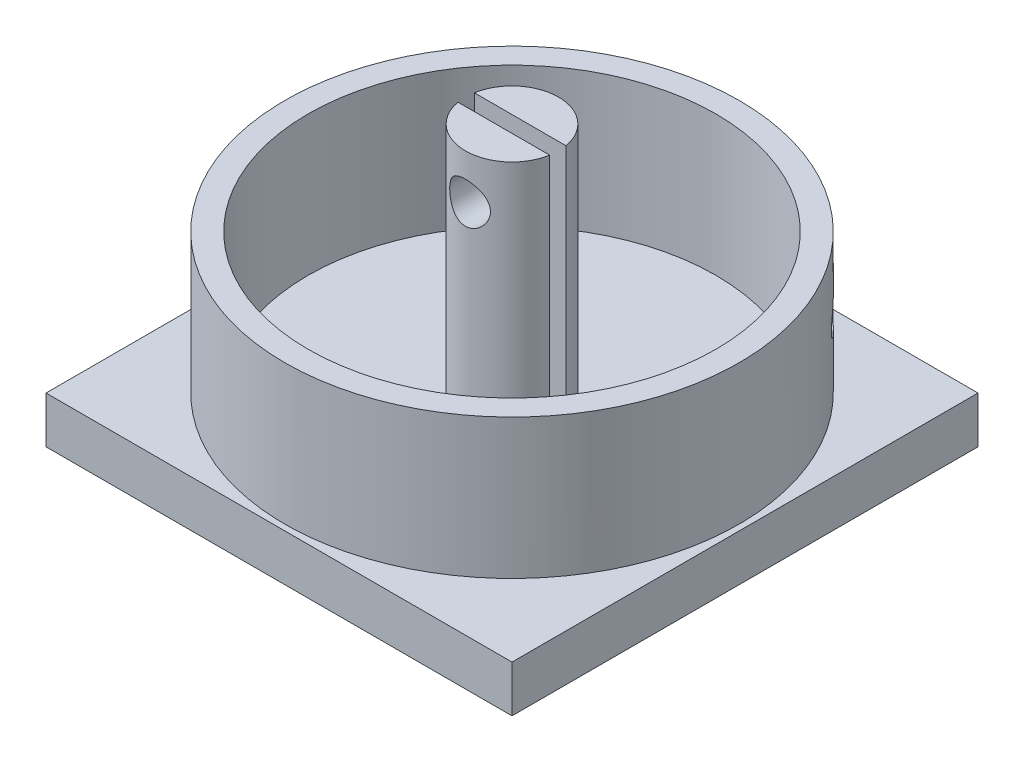
ISO-10303-21;
HEADER;
FILE_DESCRIPTION(('STEP AP214'),'2;1');
FILE_NAME('part.step','',(''),(''),'','','');
FILE_SCHEMA(('AUTOMOTIVE_DESIGN { 1 0 10303 214 1 1 1 1 }'));
ENDSEC;
DATA;
#1=APPLICATION_CONTEXT('core data for automotive mechanical design processes');
#2=APPLICATION_PROTOCOL_DEFINITION('international standard','automotive_design',2000,#1);
#3=PRODUCT_CONTEXT('',#1,'mechanical');
#4=PRODUCT('Part','Part','',(#3));
#5=PRODUCT_RELATED_PRODUCT_CATEGORY('part','',(#4));
#6=PRODUCT_DEFINITION_FORMATION('','',#4);
#7=PRODUCT_DEFINITION_CONTEXT('part definition',#1,'design');
#8=PRODUCT_DEFINITION('design','',#6,#7);
#9=PRODUCT_DEFINITION_SHAPE('','',#8);
#10=(LENGTH_UNIT() NAMED_UNIT(*) SI_UNIT(.MILLI.,.METRE.));
#11=(NAMED_UNIT(*) PLANE_ANGLE_UNIT() SI_UNIT($,.RADIAN.));
#12=(NAMED_UNIT(*) SI_UNIT($,.STERADIAN.) SOLID_ANGLE_UNIT());
#13=UNCERTAINTY_MEASURE_WITH_UNIT(LENGTH_MEASURE(1.E-05),#10,'distance_accuracy_value','');
#14=(GEOMETRIC_REPRESENTATION_CONTEXT(3) GLOBAL_UNCERTAINTY_ASSIGNED_CONTEXT((#13)) GLOBAL_UNIT_ASSIGNED_CONTEXT((#10,
#11,#12)) REPRESENTATION_CONTEXT('',''));
#15=CARTESIAN_POINT('',(0.,0.,0.));
#16=DIRECTION('',(0.,0.,1.));
#17=DIRECTION('',(1.,0.,0.));
#18=AXIS2_PLACEMENT_3D('',#15,#16,#17);
#19=CARTESIAN_POINT('',(0.,2.,0.));
#20=DIRECTION('',(0.,-1.,0.));
#21=DIRECTION('',(0.,0.,-1.));
#22=AXIS2_PLACEMENT_3D('',#19,#20,#21);
#23=PLANE('',#22);
#24=DIRECTION('',(1.,0.,0.));
#25=VECTOR('',#24,1.);
#26=CARTESIAN_POINT('',(0.,2.,86.5723559333128));
#27=LINE('',#26,#25);
#28=CARTESIAN_POINT('',(-27.8775764276021,2.,86.5723559333128));
#29=VERTEX_POINT('',#28);
#30=CARTESIAN_POINT('',(-23.9393026940991,2.,86.5723559333128));
#31=VERTEX_POINT('',#30);
#32=EDGE_CURVE('E220',#29,#31,#27,.T.);
#33=ORIENTED_EDGE('',*,*,#32,.F.);
#34=CARTESIAN_POINT('',(-25.9084395608506,2.,86.9223559333128));
#35=DIRECTION('',(0.,1.,0.));
#36=DIRECTION('',(0.,0.,1.));
#37=AXIS2_PLACEMENT_3D('',#34,#35,#36);
#38=CIRCLE('',#37,2.);
#39=EDGE_CURVE('E224',#31,#29,#38,.T.);
#40=ORIENTED_EDGE('',*,*,#39,.F.);
#41=EDGE_LOOP('',(#33,#40));
#42=FACE_BOUND('',#41,.T.);
#43=CARTESIAN_POINT('',(-25.9084395608506,2.,86.9223559333128));
#44=DIRECTION('',(0.,1.,0.));
#45=DIRECTION('',(0.,0.,1.));
#46=AXIS2_PLACEMENT_3D('',#43,#44,#45);
#47=CIRCLE('',#46,8.75000000000001);
#48=CARTESIAN_POINT('',(-25.9084395608506,2.,95.6723559333128));
#49=VERTEX_POINT('',#48);
#50=EDGE_CURVE('E236',#49,#49,#47,.T.);
#51=ORIENTED_EDGE('',*,*,#50,.T.);
#52=EDGE_LOOP('',(#51));
#53=FACE_BOUND('',#52,.T.);
#54=CARTESIAN_POINT('',(-25.9084395608506,2.,86.9223559333128));
#55=DIRECTION('',(0.,1.,0.));
#56=DIRECTION('',(0.,0.,1.));
#57=AXIS2_PLACEMENT_3D('',#54,#55,#56);
#58=CIRCLE('',#57,2.);
#59=CARTESIAN_POINT('',(-27.8775764276021,2.,87.2723559333128));
#60=VERTEX_POINT('',#59);
#61=CARTESIAN_POINT('',(-23.9393026940991,2.,87.2723559333128));
#62=VERTEX_POINT('',#61);
#63=EDGE_CURVE('E152',#60,#62,#58,.T.);
#64=ORIENTED_EDGE('',*,*,#63,.F.);
#65=DIRECTION('',(1.,0.,0.));
#66=VECTOR('',#65,1.);
#67=CARTESIAN_POINT('',(0.,2.,87.2723559333128));
#68=LINE('',#67,#66);
#69=EDGE_CURVE('E206',#60,#62,#68,.T.);
#70=ORIENTED_EDGE('',*,*,#69,.T.);
#71=EDGE_LOOP('',(#64,#70));
#72=FACE_BOUND('',#71,.T.);
#73=ADVANCED_FACE('F47',(#42,#53,#72),#23,.F.);
#74=CARTESIAN_POINT('',(-35.9084395608506,2.,96.9223559333128));
#75=DIRECTION('',(0.,0.,-1.));
#76=DIRECTION('',(-1.,0.,0.));
#77=AXIS2_PLACEMENT_3D('',#74,#75,#76);
#78=PLANE('',#77);
#79=DIRECTION('',(1.,0.,0.));
#80=VECTOR('',#79,1.);
#81=CARTESIAN_POINT('',(-35.9084395608506,0.,96.9223559333128));
#82=LINE('',#81,#80);
#83=CARTESIAN_POINT('',(-35.9084395608506,0.,96.9223559333128));
#84=VERTEX_POINT('',#83);
#85=CARTESIAN_POINT('',(-15.9084395608506,0.,96.9223559333128));
#86=VERTEX_POINT('',#85);
#87=EDGE_CURVE('E248',#84,#86,#82,.T.);
#88=ORIENTED_EDGE('',*,*,#87,.T.);
#89=DIRECTION('',(0.,-1.,0.));
#90=VECTOR('',#89,1.);
#91=CARTESIAN_POINT('',(-15.9084395608506,2.,96.9223559333128));
#92=LINE('',#91,#90);
#93=CARTESIAN_POINT('',(-15.9084395608506,2.,96.9223559333128));
#94=VERTEX_POINT('',#93);
#95=EDGE_CURVE('E287',#94,#86,#92,.T.);
#96=ORIENTED_EDGE('',*,*,#95,.F.);
#97=DIRECTION('',(1.,0.,0.));
#98=VECTOR('',#97,1.);
#99=CARTESIAN_POINT('',(-35.9084395608506,2.,96.9223559333128));
#100=LINE('',#99,#98);
#101=CARTESIAN_POINT('',(-35.9084395608506,2.,96.9223559333128));
#102=VERTEX_POINT('',#101);
#103=EDGE_CURVE('E249',#102,#94,#100,.T.);
#104=ORIENTED_EDGE('',*,*,#103,.F.);
#105=DIRECTION('',(0.,-1.,0.));
#106=VECTOR('',#105,1.);
#107=CARTESIAN_POINT('',(-35.9084395608506,2.,96.9223559333128));
#108=LINE('',#107,#106);
#109=EDGE_CURVE('E264',#102,#84,#108,.T.);
#110=ORIENTED_EDGE('',*,*,#109,.T.);
#111=EDGE_LOOP('',(#88,#96,#104,#110));
#112=FACE_BOUND('',#111,.T.);
#113=ADVANCED_FACE('F49',(#112),#78,.F.);
#114=CARTESIAN_POINT('',(-15.9084395608506,2.,76.9223559333128));
#115=DIRECTION('',(1.,0.,0.));
#116=DIRECTION('',(0.,0.,-1.));
#117=AXIS2_PLACEMENT_3D('',#114,#115,#116);
#118=PLANE('',#117);
#119=DIRECTION('',(0.,0.,1.));
#120=VECTOR('',#119,1.);
#121=CARTESIAN_POINT('',(-15.9084395608506,0.,76.9223559333128));
#122=LINE('',#121,#120);
#123=CARTESIAN_POINT('',(-15.9084395608506,0.,76.9223559333128));
#124=VERTEX_POINT('',#123);
#125=EDGE_CURVE('E268',#124,#86,#122,.T.);
#126=ORIENTED_EDGE('',*,*,#125,.F.);
#127=DIRECTION('',(0.,-1.,0.));
#128=VECTOR('',#127,1.);
#129=CARTESIAN_POINT('',(-15.9084395608506,2.,76.9223559333128));
#130=LINE('',#129,#128);
#131=CARTESIAN_POINT('',(-15.9084395608506,2.,76.9223559333128));
#132=VERTEX_POINT('',#131);
#133=EDGE_CURVE('E284',#132,#124,#130,.T.);
#134=ORIENTED_EDGE('',*,*,#133,.F.);
#135=DIRECTION('',(0.,0.,1.));
#136=VECTOR('',#135,1.);
#137=CARTESIAN_POINT('',(-15.9084395608506,2.,76.9223559333128));
#138=LINE('',#137,#136);
#139=EDGE_CURVE('E252',#132,#94,#138,.T.);
#140=ORIENTED_EDGE('',*,*,#139,.T.);
#141=ORIENTED_EDGE('',*,*,#95,.T.);
#142=EDGE_LOOP('',(#126,#134,#140,#141));
#143=FACE_BOUND('',#142,.T.);
#144=ADVANCED_FACE('F345',(#143),#118,.T.);
#145=CARTESIAN_POINT('',(-35.9084395608506,2.,76.9223559333128));
#146=DIRECTION('',(0.,0.,-1.));
#147=DIRECTION('',(-1.,0.,0.));
#148=AXIS2_PLACEMENT_3D('',#145,#146,#147);
#149=PLANE('',#148);
#150=DIRECTION('',(1.,0.,0.));
#151=VECTOR('',#150,1.);
#152=CARTESIAN_POINT('',(-35.9084395608506,0.,76.9223559333128));
#153=LINE('',#152,#151);
#154=CARTESIAN_POINT('',(-35.9084395608506,0.,76.9223559333128));
#155=VERTEX_POINT('',#154);
#156=EDGE_CURVE('E272',#155,#124,#153,.T.);
#157=ORIENTED_EDGE('',*,*,#156,.F.);
#158=DIRECTION('',(0.,-1.,0.));
#159=VECTOR('',#158,1.);
#160=CARTESIAN_POINT('',(-35.9084395608506,2.,76.9223559333128));
#161=LINE('',#160,#159);
#162=CARTESIAN_POINT('',(-35.9084395608506,2.,76.9223559333128));
#163=VERTEX_POINT('',#162);
#164=EDGE_CURVE('E281',#163,#155,#161,.T.);
#165=ORIENTED_EDGE('',*,*,#164,.F.);
#166=DIRECTION('',(1.,0.,0.));
#167=VECTOR('',#166,1.);
#168=CARTESIAN_POINT('',(-35.9084395608506,2.,76.9223559333128));
#169=LINE('',#168,#167);
#170=EDGE_CURVE('E257',#163,#132,#169,.T.);
#171=ORIENTED_EDGE('',*,*,#170,.T.);
#172=ORIENTED_EDGE('',*,*,#133,.T.);
#173=EDGE_LOOP('',(#157,#165,#171,#172));
#174=FACE_BOUND('',#173,.T.);
#175=ADVANCED_FACE('F359',(#174),#149,.T.);
#176=CARTESIAN_POINT('',(-35.9084395608506,2.,76.9223559333128));
#177=DIRECTION('',(1.,0.,0.));
#178=DIRECTION('',(0.,0.,-1.));
#179=AXIS2_PLACEMENT_3D('',#176,#177,#178);
#180=PLANE('',#179);
#181=DIRECTION('',(0.,0.,1.));
#182=VECTOR('',#181,1.);
#183=CARTESIAN_POINT('',(-35.9084395608506,0.,76.9223559333128));
#184=LINE('',#183,#182);
#185=EDGE_CURVE('E253',#155,#84,#184,.T.);
#186=ORIENTED_EDGE('',*,*,#185,.T.);
#187=ORIENTED_EDGE('',*,*,#109,.F.);
#188=DIRECTION('',(0.,0.,1.));
#189=VECTOR('',#188,1.);
#190=CARTESIAN_POINT('',(-35.9084395608506,2.,76.9223559333128));
#191=LINE('',#190,#189);
#192=EDGE_CURVE('E261',#163,#102,#191,.T.);
#193=ORIENTED_EDGE('',*,*,#192,.F.);
#194=ORIENTED_EDGE('',*,*,#164,.T.);
#195=EDGE_LOOP('',(#186,#187,#193,#194));
#196=FACE_BOUND('',#195,.T.);
#197=ADVANCED_FACE('F351',(#196),#180,.F.);
#198=CARTESIAN_POINT('',(-25.9084395608506,2.,86.9223559333128));
#199=DIRECTION('',(0.,-1.,0.));
#200=DIRECTION('',(0.,0.,-1.));
#201=AXIS2_PLACEMENT_3D('',#198,#199,#200);
#202=CIRCLE('',#201,9.75);
#203=CARTESIAN_POINT('',(-25.9084395608506,2.,77.1723559333128));
#204=VERTEX_POINT('',#203);
#205=EDGE_CURVE('E290',#204,#204,#202,.F.);
#206=ORIENTED_EDGE('',*,*,#205,.F.);
#207=EDGE_LOOP('',(#206));
#208=FACE_BOUND('',#207,.T.);
#209=ORIENTED_EDGE('',*,*,#103,.T.);
#210=ORIENTED_EDGE('',*,*,#139,.F.);
#211=ORIENTED_EDGE('',*,*,#170,.F.);
#212=ORIENTED_EDGE('',*,*,#192,.T.);
#213=EDGE_LOOP('',(#209,#210,#211,#212));
#214=FACE_BOUND('',#213,.T.);
#215=ADVANCED_FACE('F340',(#208,#214),#23,.F.);
#216=CARTESIAN_POINT('',(0.,0.,0.));
#217=DIRECTION('',(0.,-1.,0.));
#218=DIRECTION('',(0.,0.,-1.));
#219=AXIS2_PLACEMENT_3D('',#216,#217,#218);
#220=PLANE('',#219);
#221=ORIENTED_EDGE('',*,*,#87,.F.);
#222=ORIENTED_EDGE('',*,*,#185,.F.);
#223=ORIENTED_EDGE('',*,*,#156,.T.);
#224=ORIENTED_EDGE('',*,*,#125,.T.);
#225=EDGE_LOOP('',(#221,#222,#223,#224));
#226=FACE_BOUND('',#225,.T.);
#227=ADVANCED_FACE('F350',(#226),#220,.T.);
#228=CARTESIAN_POINT('',(-25.9084395608506,8.,86.9223559333128));
#229=DIRECTION('',(0.,1.,0.));
#230=DIRECTION('',(0.,0.,1.));
#231=AXIS2_PLACEMENT_3D('',#228,#229,#230);
#232=PLANE('',#231);
#233=CARTESIAN_POINT('',(-25.9084395608506,8.,86.9223559333128));
#234=DIRECTION('',(0.,1.,0.));
#235=DIRECTION('',(0.,0.,1.));
#236=AXIS2_PLACEMENT_3D('',#233,#234,#235);
#237=CIRCLE('',#236,9.75);
#238=CARTESIAN_POINT('',(-25.9084395608506,8.,96.6723559333128));
#239=VERTEX_POINT('',#238);
#240=EDGE_CURVE('E241',#239,#239,#237,.T.);
#241=ORIENTED_EDGE('',*,*,#240,.T.);
#242=EDGE_LOOP('',(#241));
#243=FACE_BOUND('',#242,.T.);
#244=CARTESIAN_POINT('',(-25.9084395608506,8.,86.9223559333128));
#245=DIRECTION('',(0.,1.,0.));
#246=DIRECTION('',(0.,0.,1.));
#247=AXIS2_PLACEMENT_3D('',#244,#245,#246);
#248=CIRCLE('',#247,8.75000000000001);
#249=CARTESIAN_POINT('',(-25.9084395608506,8.,95.6723559333128));
#250=VERTEX_POINT('',#249);
#251=EDGE_CURVE('E237',#250,#250,#248,.T.);
#252=ORIENTED_EDGE('',*,*,#251,.F.);
#253=EDGE_LOOP('',(#252));
#254=FACE_BOUND('',#253,.T.);
#255=ADVANCED_FACE('F356',(#243,#254),#232,.T.);
#256=CARTESIAN_POINT('',(-25.9084395608506,8.,86.9223559333128));
#257=DIRECTION('',(0.,-1.,0.));
#258=DIRECTION('',(0.,0.,-1.));
#259=AXIS2_PLACEMENT_3D('',#256,#257,#258);
#260=CYLINDRICAL_SURFACE('',#259,9.75);
#261=CARTESIAN_POINT('',(-19.5084395608506,5.,79.5669157697331));
#262=CARTESIAN_POINT('',(-19.5084359963088,4.97238794856421,79.5669186291084));
#263=CARTESIAN_POINT('',(-19.5065172996198,4.94474269239329,79.5685869574915));
#264=CARTESIAN_POINT('',(-19.4989723384031,4.89031774963788,79.5751623715159));
#265=CARTESIAN_POINT('',(-19.4933369869705,4.863540353668,79.5800773950977));
#266=CARTESIAN_POINT('',(-19.4787909119465,4.81180554230704,79.5928122928958));
#267=CARTESIAN_POINT('',(-19.4698990403711,4.78683862334073,79.6006154503929));
#268=CARTESIAN_POINT('',(-19.4493589377121,4.73907187349745,79.6187291102019));
#269=CARTESIAN_POINT('',(-19.437710731116,4.71627202337039,79.6290395902384));
#270=CARTESIAN_POINT('',(-19.4079851478075,4.66598704496538,79.6555062392093));
#271=CARTESIAN_POINT('',(-19.3890537510334,4.63943136708399,79.6724693469058));
#272=CARTESIAN_POINT('',(-19.3484000573267,4.59080096647465,79.709233376142));
#273=CARTESIAN_POINT('',(-19.3266727511212,4.56873447450812,79.729039398709));
#274=CARTESIAN_POINT('',(-19.2737177015857,4.52230314108146,79.777802003914));
#275=CARTESIAN_POINT('',(-19.2417526871992,4.49966205866907,79.8075955636834));
#276=CARTESIAN_POINT('',(-19.1760600126778,4.46164701300943,79.8697234918576));
#277=CARTESIAN_POINT('',(-19.1423298723712,4.44628359755214,79.9020614693631));
#278=CARTESIAN_POINT('',(-19.0634078116034,4.4184106513881,79.9788741861019));
#279=CARTESIAN_POINT('',(-19.0179551776392,4.40832820685072,80.0239608507682));
#280=CARTESIAN_POINT('',(-18.9274115848876,4.39857040031742,80.1156007098057));
#281=CARTESIAN_POINT('',(-18.8823211564043,4.39890822052317,80.1621556873318));
#282=CARTESIAN_POINT('',(-18.7929641585505,4.40947453417278,80.2562638557812));
#283=CARTESIAN_POINT('',(-18.748720081905,4.41985126399916,80.3038215469583));
#284=CARTESIAN_POINT('',(-18.6628109201821,4.45068297756411,80.3979855574));
#285=CARTESIAN_POINT('',(-18.6211429433431,4.47112642105746,80.4445929025552));
#286=CARTESIAN_POINT('',(-18.5540444695252,4.51474846131435,80.5210195294203));
#287=CARTESIAN_POINT('',(-18.5275898708819,4.53510616994982,80.5515575547092));
#288=CARTESIAN_POINT('',(-18.4772002942664,4.58142819238827,80.6104093097352));
#289=CARTESIAN_POINT('',(-18.4532613313137,4.60738343386089,80.6387265387795));
#290=CARTESIAN_POINT('',(-18.4156411754014,4.65677619609651,80.6836813381348));
#291=CARTESIAN_POINT('',(-18.4010367216926,4.67863444966997,80.7012748199952));
#292=CARTESIAN_POINT('',(-18.374197136999,4.72556763758197,80.7338074070995));
#293=CARTESIAN_POINT('',(-18.361958312292,4.75063745387693,80.7487506474051));
#294=CARTESIAN_POINT('',(-18.3431568314849,4.79766985905099,80.7718140326182));
#295=CARTESIAN_POINT('',(-18.3359361258705,4.81898304675126,80.780712472587));
#296=CARTESIAN_POINT('',(-18.3237945437469,4.86320024114752,80.795713010007));
#297=CARTESIAN_POINT('',(-18.3188715461522,4.8861027581556,80.8018176863663));
#298=CARTESIAN_POINT('',(-18.31169611156,4.93316226945932,80.8107257648616));
#299=CARTESIAN_POINT('',(-18.3094653261441,4.95732782477366,80.8135024006896));
#300=CARTESIAN_POINT('',(-18.3079776499202,5.005889934099,80.8153533387997));
#301=CARTESIAN_POINT('',(-18.3087195338242,5.03028638880094,80.8144291664975));
#302=CARTESIAN_POINT('',(-18.3128289758088,5.07550890957277,80.8093200467615));
#303=CARTESIAN_POINT('',(-18.3158720705513,5.09641316814422,80.805538084805));
#304=CARTESIAN_POINT('',(-18.3239676872893,5.13720690046533,80.7955029210152));
#305=CARTESIAN_POINT('',(-18.3290211176054,5.15709591091048,80.7892486021163));
#306=CARTESIAN_POINT('',(-18.3431027691764,5.20289623232888,80.7718806970445));
#307=CARTESIAN_POINT('',(-18.3529119142877,5.22820812583183,80.7598235471484));
#308=CARTESIAN_POINT('',(-18.3750416091179,5.27601509394217,80.7327903480292));
#309=CARTESIAN_POINT('',(-18.3873676643627,5.29850381592048,80.7178079031761));
#310=CARTESIAN_POINT('',(-18.4202136053354,5.35069432804102,80.6781662823561));
#311=CARTESIAN_POINT('',(-18.4418476365273,5.37876097648686,80.6522870001815));
#312=CARTESIAN_POINT('',(-18.4879336344741,5.42935869977051,80.5978102381888));
#313=CARTESIAN_POINT('',(-18.5123913483865,5.45187818176548,80.5692072361505));
#314=CARTESIAN_POINT('',(-18.5748876023786,5.50095978673163,80.4970392308141));
#315=CARTESIAN_POINT('',(-18.6140620146709,5.52473717947433,80.4525625854947));
#316=CARTESIAN_POINT('',(-18.6952571764282,5.562637141679,80.3621567675283));
#317=CARTESIAN_POINT('',(-18.73728110624,5.57674872151285,80.3162260034512));
#318=CARTESIAN_POINT('',(-18.8241952707676,5.59575733464351,80.2230924214886));
#319=CARTESIAN_POINT('',(-18.8691295665723,5.60043101867108,80.175884987566));
#320=CARTESIAN_POINT('',(-18.9598873878446,5.5995075954328,80.082447228432));
#321=CARTESIAN_POINT('',(-19.0057100240568,5.5939202826152,80.0362160139914));
#322=CARTESIAN_POINT('',(-19.0873768976895,5.57390032777643,79.9554203605115));
#323=CARTESIAN_POINT('',(-19.1233117722432,5.56155219040716,79.9204313782413));
#324=CARTESIAN_POINT('',(-19.1938781257055,5.5291765271501,79.8527350543345));
#325=CARTESIAN_POINT('',(-19.2285113401974,5.50915965649088,79.8200246209917));
#326=CARTESIAN_POINT('',(-19.2865524597538,5.46687633533913,79.7659413140369));
#327=CARTESIAN_POINT('',(-19.3105836090032,5.44646013449504,79.7437937351087));
#328=CARTESIAN_POINT('',(-19.3561726015584,5.4007169085624,79.7021588990329));
#329=CARTESIAN_POINT('',(-19.3777337799028,5.37539663252787,79.6826680477608));
#330=CARTESIAN_POINT('',(-19.4131725666813,5.32554500988595,79.6508736095514));
#331=CARTESIAN_POINT('',(-19.4277199087705,5.30191006631685,79.6379152443722));
#332=CARTESIAN_POINT('',(-19.4537988204024,5.2517527455337,79.6147970500571));
#333=CARTESIAN_POINT('',(-19.4653321618205,5.225232077832,79.6046355764925));
#334=CARTESIAN_POINT('',(-19.4833531483845,5.17355335205935,79.5888104497969));
#335=CARTESIAN_POINT('',(-19.4903093661658,5.14868756671825,79.5827269638937));
#336=CARTESIAN_POINT('',(-19.5009833940939,5.0977929070653,79.573406533784));
#337=CARTESIAN_POINT('',(-19.5047094083237,5.07176715684732,79.5701623780346));
#338=CARTESIAN_POINT('',(-19.5078624973763,5.03040673636078,79.5674178701587));
#339=CARTESIAN_POINT('',(-19.5084415241598,5.01520840480989,79.5669141948217));
#340=CARTESIAN_POINT('',(-19.5084395608506,5.,79.5669157697331));
#341=B_SPLINE_CURVE_WITH_KNOTS('',3,(#261,#262,#263,#264,#265,#266,#267,#268,#269,#270,#271,
#272,#273,#274,#275,#276,#277,#278,#279,#280,#281,#282,#283,#284,#285,#286,#287,#288,#289,#290,
#291,#292,#293,#294,#295,#296,#297,#298,#299,#300,#301,#302,#303,#304,#305,#306,#307,#308,#309,
#310,#311,#312,#313,#314,#315,#316,#317,#318,#319,#320,#321,#322,#323,#324,#325,#326,#327,#328,
#329,#330,#331,#332,#333,#334,#335,#336,#337,#338,#339,#340),.UNSPECIFIED.,.T.,.F.,(4,2,2,2,2,2,
2,2,2,2,2,2,2,2,2,2,2,2,2,2,2,2,2,2,2,2,2,2,2,2,2,2,2,2,2,2,2,2,2,4),(0.,0.0827809948879761,
0.165765136312603,0.248276285468944,0.330786701609955,0.440467248052158,0.550347112623641,
0.697188550710931,0.844242165216274,1.03766080347347,1.2313241368518,1.42789148516045,
1.62423401602755,1.75960372302634,1.89475565360355,1.98937638027252,2.08384814987741,
2.15617229120908,2.22842953518326,2.30126410186198,2.37406865035547,2.43817043231273,
2.50230121003878,2.59091352227929,2.67972178371712,2.81063435065556,2.94181822955987,
3.13238706164754,3.32317220453373,3.51842175731456,3.71348503503998,3.86792369796774,
4.0221485516633,4.13735643521762,4.25240688049366,4.34394347803045,4.43542614121746,
4.51467153172902,4.59371505985641,4.6393098931034),.UNSPECIFIED.);
#342=CARTESIAN_POINT('',(-19.5084395608506,5.,79.5669157697331));
#343=VERTEX_POINT('',#342);
#344=EDGE_CURVE('E167',#343,#343,#341,.T.);
#345=ORIENTED_EDGE('',*,*,#344,.T.);
#346=EDGE_LOOP('',(#345));
#347=FACE_BOUND('',#346,.T.);
#348=ORIENTED_EDGE('',*,*,#240,.F.);
#349=EDGE_LOOP('',(#348));
#350=FACE_BOUND('',#349,.T.);
#351=ORIENTED_EDGE('',*,*,#205,.T.);
#352=EDGE_LOOP('',(#351));
#353=FACE_BOUND('',#352,.T.);
#354=ADVANCED_FACE('F415',(#347,#350,#353),#260,.T.);
#355=CARTESIAN_POINT('',(-25.9084395608506,8.,86.9223559333128));
#356=DIRECTION('',(0.,-1.,0.));
#357=DIRECTION('',(0.,0.,-1.));
#358=AXIS2_PLACEMENT_3D('',#355,#356,#357);
#359=CYLINDRICAL_SURFACE('',#358,8.75000000000001);
#360=CARTESIAN_POINT('',(-19.5084395608506,5.,80.9555728804441));
#361=CARTESIAN_POINT('',(-19.5084387528728,4.97401566966149,80.9555736729689));
#362=CARTESIAN_POINT('',(-19.506737190252,4.94802587142228,80.957397276435));
#363=CARTESIAN_POINT('',(-19.5000875141236,4.89695957300873,80.9645420162059));
#364=CARTESIAN_POINT('',(-19.4951372074713,4.87188370188244,80.9698655152056));
#365=CARTESIAN_POINT('',(-19.4824458210924,4.82354043257815,80.9835690501414));
#366=CARTESIAN_POINT('',(-19.4747234286913,4.80026216358922,80.9919286234702));
#367=CARTESIAN_POINT('',(-19.456997437795,4.75574697477624,81.0112167615493));
#368=CARTESIAN_POINT('',(-19.4469927672888,4.73451102093502,81.022146533625));
#369=CARTESIAN_POINT('',(-19.4206733131822,4.68588808902734,81.0510775761281));
#370=CARTESIAN_POINT('',(-19.4034640155474,4.65961228152229,81.0701300059194));
#371=CARTESIAN_POINT('',(-19.3666749011582,4.61148732894346,81.1112817253098));
#372=CARTESIAN_POINT('',(-19.3470900541799,4.5896478486655,81.1333874945751));
#373=CARTESIAN_POINT('',(-19.2969551380615,4.54088561099262,81.1906194127923));
#374=CARTESIAN_POINT('',(-19.265549035416,4.51633828206392,81.2270118332081));
#375=CARTESIAN_POINT('',(-19.2013402113571,4.47495618898839,81.3027643097152));
#376=CARTESIAN_POINT('',(-19.1685350616196,4.45813548527607,81.342129625371));
#377=CARTESIAN_POINT('',(-19.0862556587336,4.42448046380033,81.4427269904736));
#378=CARTESIAN_POINT('',(-19.0365587707949,4.41175088328775,81.5051478759527));
#379=CARTESIAN_POINT('',(-18.9383152482067,4.39869557921577,81.6321415677669));
#380=CARTESIAN_POINT('',(-18.8897712146492,4.39839565159237,81.6967185710515));
#381=CARTESIAN_POINT('',(-18.7930955557418,4.40910944381662,81.8290930382891));
#382=CARTESIAN_POINT('',(-18.7450495017828,4.42055296863309,81.8969197117837));
#383=CARTESIAN_POINT('',(-18.6755464473796,4.44649501246296,81.9979840034293));
#384=CARTESIAN_POINT('',(-18.6528214903457,4.45659498967832,82.0315361608149));
#385=CARTESIAN_POINT('',(-18.6083247924597,4.47984447535146,82.0982057353014));
#386=CARTESIAN_POINT('',(-18.586552584974,4.49299247063373,82.131323359533));
#387=CARTESIAN_POINT('',(-18.5423177263733,4.52382450221889,82.1995875741462));
#388=CARTESIAN_POINT('',(-18.5199532006892,4.54179873167985,82.2346679389466));
#389=CARTESIAN_POINT('',(-18.4768338853386,4.5821595706533,82.3033327979432));
#390=CARTESIAN_POINT('',(-18.4560796042505,4.60454756636421,82.3369168181209));
#391=CARTESIAN_POINT('',(-18.4206257562735,4.64972341805131,82.3950972802847));
#392=CARTESIAN_POINT('',(-18.4055346116719,4.67158240075035,82.4201694490115));
#393=CARTESIAN_POINT('',(-18.3773835736155,4.71938164938966,82.4674213058226));
#394=CARTESIAN_POINT('',(-18.3643179002489,4.74530986069878,82.4896091941388));
#395=CARTESIAN_POINT('',(-18.3461363394353,4.78994029765169,82.5207371234166));
#396=CARTESIAN_POINT('',(-18.3399930367995,4.80707159976094,82.5313153673703));
#397=CARTESIAN_POINT('',(-18.329057001088,4.84294497641866,82.5502193328643));
#398=CARTESIAN_POINT('',(-18.3242624497364,4.86168483749653,82.5585480863729));
#399=CARTESIAN_POINT('',(-18.3170087540403,4.89757563861579,82.5711809620159));
#400=CARTESIAN_POINT('',(-18.3143033569014,4.91452533363368,82.5759078755828));
#401=CARTESIAN_POINT('',(-18.3103500807549,4.94910047500803,82.5828222520475));
#402=CARTESIAN_POINT('',(-18.3091008268708,4.96672526767325,82.5850121103967));
#403=CARTESIAN_POINT('',(-18.3081806688368,5.00220163777397,82.5866246378346));
#404=CARTESIAN_POINT('',(-18.3085146829719,5.02005374985918,82.5860386841072));
#405=CARTESIAN_POINT('',(-18.3107364786829,5.05536024435358,82.5821471263146));
#406=CARTESIAN_POINT('',(-18.3126253508245,5.07281433876289,82.578839613369));
#407=CARTESIAN_POINT('',(-18.3182810795558,5.11016076882569,82.5689627912639));
#408=CARTESIAN_POINT('',(-18.3223402901653,5.12987255723841,82.5618867049463));
#409=CARTESIAN_POINT('',(-18.3320229686014,5.16771251512,82.5450844521897));
#410=CARTESIAN_POINT('',(-18.3376493648934,5.1858376355661,82.5353533252076));
#411=CARTESIAN_POINT('',(-18.3534626983148,5.2297924887378,82.5081533524583));
#412=CARTESIAN_POINT('',(-18.364470391375,5.25448743062065,82.4893460733241));
#413=CARTESIAN_POINT('',(-18.3883867183781,5.3003613488173,82.4488939416171));
#414=CARTESIAN_POINT('',(-18.4013001790464,5.32153109831336,82.4272418998777));
#415=CARTESIAN_POINT('',(-18.4271625374477,5.35893835393152,82.3843431554088));
#416=CARTESIAN_POINT('',(-18.4399865371586,5.37545508779706,82.3632607959322));
#417=CARTESIAN_POINT('',(-18.4665118072727,5.40634209850529,82.3200895407832));
#418=CARTESIAN_POINT('',(-18.4802137548671,5.42071068923275,82.2979998720188));
#419=CARTESIAN_POINT('',(-18.5224407455997,5.46100595722105,82.2306269243311));
#420=CARTESIAN_POINT('',(-18.5520507206248,5.4840727129696,82.1843001088406));
#421=CARTESIAN_POINT('',(-18.6068657769533,5.51949495446309,82.1003768537243));
#422=CARTESIAN_POINT('',(-18.6316701672528,5.53308493860696,82.063016692927));
#423=CARTESIAN_POINT('',(-18.682416405911,5.55650198017522,81.987870165084));
#424=CARTESIAN_POINT('',(-18.708358906622,5.56632684722202,81.9500835630714));
#425=CARTESIAN_POINT('',(-18.7876391989972,5.59030855603924,81.8365743666875));
#426=CARTESIAN_POINT('',(-18.842470194457,5.5989978007432,81.7606402663771));
#427=CARTESIAN_POINT('',(-18.943340364391,5.60065383603989,81.6256084668666));
#428=CARTESIAN_POINT('',(-18.9889331240034,5.59642825623775,81.5661927539091));
#429=CARTESIAN_POINT('',(-19.0806772951992,5.57665609573247,81.4497332395887));
#430=CARTESIAN_POINT('',(-19.1268269705488,5.56113862879309,81.3926837365089));
#431=CARTESIAN_POINT('',(-19.2008313974257,5.52489302569815,81.3034136998173));
#432=CARTESIAN_POINT('',(-19.2290941369022,5.50826246433788,81.2698639926699));
#433=CARTESIAN_POINT('',(-19.284291836478,5.4689162334694,81.2052801562211));
#434=CARTESIAN_POINT('',(-19.3112282772556,5.44620754072587,81.1742431955411));
#435=CARTESIAN_POINT('',(-19.3559749062426,5.40057189943324,81.1233428423935));
#436=CARTESIAN_POINT('',(-19.374367709397,5.37915931536894,81.1026413483604));
#437=CARTESIAN_POINT('',(-19.4088819952803,5.33226735290557,81.064121030852));
#438=CARTESIAN_POINT('',(-19.425006820268,5.30679407937884,81.0462979596521));
#439=CARTESIAN_POINT('',(-19.4506026146265,5.25813147017686,81.018194828076));
#440=CARTESIAN_POINT('',(-19.4607513331169,5.23575980773213,81.0071224027268));
#441=CARTESIAN_POINT('',(-19.4784899406451,5.18886144056744,80.9878450169197));
#442=CARTESIAN_POINT('',(-19.4860826787296,5.16433717398268,80.9796368633992));
#443=CARTESIAN_POINT('',(-19.4974262177186,5.11670503600203,80.9674025593449));
#444=CARTESIAN_POINT('',(-19.5015287959211,5.09378052430882,80.9629926779535));
#445=CARTESIAN_POINT('',(-19.507035506054,5.04723873452916,80.9570778321098));
#446=CARTESIAN_POINT('',(-19.5084402953606,5.02362162663359,80.9555721599821));
#447=CARTESIAN_POINT('',(-19.5084395608506,5.,80.9555728804441));
#448=B_SPLINE_CURVE_WITH_KNOTS('',3,(#360,#361,#362,#363,#364,#365,#366,#367,#368,#369,#370,
#371,#372,#373,#374,#375,#376,#377,#378,#379,#380,#381,#382,#383,#384,#385,#386,#387,#388,#389,
#390,#391,#392,#393,#394,#395,#396,#397,#398,#399,#400,#401,#402,#403,#404,#405,#406,#407,#408,
#409,#410,#411,#412,#413,#414,#415,#416,#417,#418,#419,#420,#421,#422,#423,#424,#425,#426,#427,
#428,#429,#430,#431,#432,#433,#434,#435,#436,#437,#438,#439,#440,#441,#442,#443,#444,#445,#446,
#447),.UNSPECIFIED.,.T.,.F.,(4,2,2,2,2,2,2,2,2,2,2,2,2,2,2,2,2,2,2,2,2,2,2,2,2,2,2,2,2,2,2,2,2,
2,2,2,2,2,2,2,2,2,2,4),(0.,0.0778486665252904,0.155749940842486,0.233135632446147,
0.310557748080186,0.420153740851526,0.5299859929592,0.691012021905731,0.852329926402969,
1.09340301997145,1.33497640066786,1.58571791928633,1.71091300535468,1.83604607145524,
1.97179501513041,2.10758666056904,2.21690492906311,2.32590526341202,2.38888597331756,
2.45178136638626,2.50496828615918,2.55810494656753,2.6114067793828,2.66474602958704,
2.72839190590285,2.79215751900328,2.89041019234414,2.98891612153764,3.07786860898618,
3.16689055431158,3.34518991196916,3.48560816725699,3.62610798807524,3.90687536653929,
4.13124361364603,4.35503541472115,4.49541867587764,4.63564148448989,4.74032109885984,
4.8448447960871,4.92537860194767,5.0058223405154,5.07660963303265,5.14737967446251),.UNSPECIFIED.);
#449=CARTESIAN_POINT('',(-19.5084395608506,5.,80.9555728804441));
#450=VERTEX_POINT('',#449);
#451=EDGE_CURVE('E51',#450,#450,#448,.T.);
#452=ORIENTED_EDGE('',*,*,#451,.F.);
#453=EDGE_LOOP('',(#452));
#454=FACE_BOUND('',#453,.T.);
#455=ORIENTED_EDGE('',*,*,#251,.T.);
#456=EDGE_LOOP('',(#455));
#457=FACE_BOUND('',#456,.T.);
#458=ORIENTED_EDGE('',*,*,#50,.F.);
#459=EDGE_LOOP('',(#458));
#460=FACE_BOUND('',#459,.T.);
#461=ADVANCED_FACE('F424',(#454,#457,#460),#359,.F.);
#462=CARTESIAN_POINT('',(0.,11.,86.5723559333128));
#463=DIRECTION('',(0.,0.,-1.));
#464=DIRECTION('',(-1.,0.,0.));
#465=AXIS2_PLACEMENT_3D('',#462,#463,#464);
#466=PLANE('',#465);
#467=DIRECTION('',(0.,-1.,0.));
#468=VECTOR('',#467,1.);
#469=CARTESIAN_POINT('',(-26.7834395608506,0.,86.5723559333128));
#470=LINE('',#469,#468);
#471=CARTESIAN_POINT('',(-26.7834395608506,10.95,86.5723559333128));
#472=VERTEX_POINT('',#471);
#473=CARTESIAN_POINT('',(-26.7834395608506,9.2,86.5723559333128));
#474=VERTEX_POINT('',#473);
#475=EDGE_CURVE('E191',#472,#474,#470,.T.);
#476=ORIENTED_EDGE('',*,*,#475,.F.);
#477=DIRECTION('',(-1.,0.,0.));
#478=VECTOR('',#477,1.);
#479=CARTESIAN_POINT('',(0.,10.95,86.5723559333128));
#480=LINE('',#479,#478);
#481=CARTESIAN_POINT('',(-25.0334395608506,10.95,86.5723559333128));
#482=VERTEX_POINT('',#481);
#483=EDGE_CURVE('E70',#482,#472,#480,.T.);
#484=ORIENTED_EDGE('',*,*,#483,.F.);
#485=DIRECTION('',(0.,1.,0.));
#486=VECTOR('',#485,1.);
#487=CARTESIAN_POINT('',(-25.0334395608506,0.,86.5723559333128));
#488=LINE('',#487,#486);
#489=CARTESIAN_POINT('',(-25.0334395608506,9.2,86.5723559333128));
#490=VERTEX_POINT('',#489);
#491=EDGE_CURVE('E198',#490,#482,#488,.T.);
#492=ORIENTED_EDGE('',*,*,#491,.F.);
#493=DIRECTION('',(-1.,0.,0.));
#494=VECTOR('',#493,1.);
#495=CARTESIAN_POINT('',(0.,9.2,86.5723559333128));
#496=LINE('',#495,#494);
#497=EDGE_CURVE('E194',#490,#474,#496,.T.);
#498=ORIENTED_EDGE('',*,*,#497,.T.);
#499=EDGE_LOOP('',(#476,#484,#492,#498));
#500=FACE_BOUND('',#499,.T.);
#501=ORIENTED_EDGE('',*,*,#32,.T.);
#502=DIRECTION('',(0.,-1.,0.));
#503=VECTOR('',#502,1.);
#504=CARTESIAN_POINT('',(-23.9393026940991,11.,86.5723559333128));
#505=LINE('',#504,#503);
#506=CARTESIAN_POINT('',(-23.9393026940991,12.,86.5723559333128));
#507=VERTEX_POINT('',#506);
#508=EDGE_CURVE('E232',#507,#31,#505,.T.);
#509=ORIENTED_EDGE('',*,*,#508,.F.);
#510=DIRECTION('',(-1.,0.,0.));
#511=VECTOR('',#510,1.);
#512=CARTESIAN_POINT('',(0.,12.,86.5723559333128));
#513=LINE('',#512,#511);
#514=CARTESIAN_POINT('',(-27.8775764276021,12.,86.5723559333128));
#515=VERTEX_POINT('',#514);
#516=EDGE_CURVE('E163',#507,#515,#513,.T.);
#517=ORIENTED_EDGE('',*,*,#516,.T.);
#518=DIRECTION('',(0.,-1.,0.));
#519=VECTOR('',#518,1.);
#520=CARTESIAN_POINT('',(-27.8775764276021,11.,86.5723559333128));
#521=LINE('',#520,#519);
#522=EDGE_CURVE('E228',#515,#29,#521,.T.);
#523=ORIENTED_EDGE('',*,*,#522,.T.);
#524=EDGE_LOOP('',(#501,#509,#517,#523));
#525=FACE_BOUND('',#524,.T.);
#526=ADVANCED_FACE('F432',(#500,#525),#466,.F.);
#527=CARTESIAN_POINT('',(-25.9084395608506,11.,86.9223559333128));
#528=DIRECTION('',(0.,-1.,0.));
#529=DIRECTION('',(0.,0.,-1.));
#530=AXIS2_PLACEMENT_3D('',#527,#528,#529);
#531=CYLINDRICAL_SURFACE('',#530,2.);
#532=DIRECTION('',(0.,-1.,0.));
#533=VECTOR('',#532,1.);
#534=CARTESIAN_POINT('',(-25.0334395608506,11.,85.1239191120705));
#535=LINE('',#534,#533);
#536=CARTESIAN_POINT('',(-25.0334395608506,9.2,85.1239191120705));
#537=VERTEX_POINT('',#536);
#538=CARTESIAN_POINT('',(-25.0334395608506,10.95,85.1239191120705));
#539=VERTEX_POINT('',#538);
#540=EDGE_CURVE('E62',#537,#539,#535,.F.);
#541=ORIENTED_EDGE('',*,*,#540,.T.);
#542=CARTESIAN_POINT('',(-25.9084395608506,10.95,86.9223559333128));
#543=DIRECTION('',(0.,1.,0.));
#544=DIRECTION('',(0.,0.,1.));
#545=AXIS2_PLACEMENT_3D('',#542,#543,#544);
#546=CIRCLE('',#545,2.);
#547=CARTESIAN_POINT('',(-26.7834395608506,10.95,85.1239191120705));
#548=VERTEX_POINT('',#547);
#549=EDGE_CURVE('E11',#539,#548,#546,.T.);
#550=ORIENTED_EDGE('',*,*,#549,.T.);
#551=DIRECTION('',(0.,-1.,0.));
#552=VECTOR('',#551,1.);
#553=CARTESIAN_POINT('',(-26.7834395608506,11.,85.1239191120705));
#554=LINE('',#553,#552);
#555=CARTESIAN_POINT('',(-26.7834395608506,9.2,85.1239191120705));
#556=VERTEX_POINT('',#555);
#557=EDGE_CURVE('E294',#548,#556,#554,.T.);
#558=ORIENTED_EDGE('',*,*,#557,.T.);
#559=CARTESIAN_POINT('',(-25.9084395608506,9.2,86.9223559333128));
#560=DIRECTION('',(0.,1.,0.));
#561=DIRECTION('',(0.,0.,1.));
#562=AXIS2_PLACEMENT_3D('',#559,#560,#561);
#563=CIRCLE('',#562,2.);
#564=EDGE_CURVE('E298',#537,#556,#563,.T.);
#565=ORIENTED_EDGE('',*,*,#564,.F.);
#566=EDGE_LOOP('',(#541,#550,#558,#565));
#567=FACE_BOUND('',#566,.T.);
#568=ORIENTED_EDGE('',*,*,#39,.T.);
#569=ORIENTED_EDGE('',*,*,#522,.F.);
#570=CARTESIAN_POINT('',(-25.9084395608506,12.,86.9223559333128));
#571=DIRECTION('',(0.,1.,0.));
#572=DIRECTION('',(0.,0.,1.));
#573=AXIS2_PLACEMENT_3D('',#570,#571,#572);
#574=CIRCLE('',#573,2.);
#575=EDGE_CURVE('E180',#507,#515,#574,.T.);
#576=ORIENTED_EDGE('',*,*,#575,.F.);
#577=ORIENTED_EDGE('',*,*,#508,.T.);
#578=EDGE_LOOP('',(#568,#569,#576,#577));
#579=FACE_BOUND('',#578,.T.);
#580=ADVANCED_FACE('F444',(#567,#579),#531,.T.);
#581=CARTESIAN_POINT('',(0.,11.,87.2723559333128));
#582=DIRECTION('',(0.,0.,-1.));
#583=DIRECTION('',(-1.,0.,0.));
#584=AXIS2_PLACEMENT_3D('',#581,#582,#583);
#585=PLANE('',#584);
#586=CARTESIAN_POINT('',(-25.9084395608506,10.075,87.2723559333128));
#587=DIRECTION('',(0.,0.,-1.));
#588=DIRECTION('',(-1.,0.,0.));
#589=AXIS2_PLACEMENT_3D('',#586,#587,#588);
#590=CIRCLE('',#589,0.875000000000002);
#591=CARTESIAN_POINT('',(-26.7834395608506,10.075,87.2723559333128));
#592=VERTEX_POINT('',#591);
#593=EDGE_CURVE('E184',#592,#592,#590,.T.);
#594=ORIENTED_EDGE('',*,*,#593,.F.);
#595=EDGE_LOOP('',(#594));
#596=FACE_BOUND('',#595,.T.);
#597=ORIENTED_EDGE('',*,*,#69,.F.);
#598=DIRECTION('',(0.,-1.,0.));
#599=VECTOR('',#598,1.);
#600=CARTESIAN_POINT('',(-27.8775764276021,11.,87.2723559333128));
#601=LINE('',#600,#599);
#602=CARTESIAN_POINT('',(-27.8775764276021,12.,87.2723559333128));
#603=VERTEX_POINT('',#602);
#604=EDGE_CURVE('E156',#603,#60,#601,.T.);
#605=ORIENTED_EDGE('',*,*,#604,.F.);
#606=DIRECTION('',(-1.,0.,0.));
#607=VECTOR('',#606,1.);
#608=CARTESIAN_POINT('',(0.,12.,87.2723559333128));
#609=LINE('',#608,#607);
#610=CARTESIAN_POINT('',(-23.9393026940991,12.,87.2723559333128));
#611=VERTEX_POINT('',#610);
#612=EDGE_CURVE('E159',#611,#603,#609,.T.);
#613=ORIENTED_EDGE('',*,*,#612,.F.);
#614=DIRECTION('',(0.,-1.,0.));
#615=VECTOR('',#614,1.);
#616=CARTESIAN_POINT('',(-23.9393026940991,11.,87.2723559333128));
#617=LINE('',#616,#615);
#618=EDGE_CURVE('E146',#611,#62,#617,.T.);
#619=ORIENTED_EDGE('',*,*,#618,.T.);
#620=EDGE_LOOP('',(#597,#605,#613,#619));
#621=FACE_BOUND('',#620,.T.);
#622=ADVANCED_FACE('F160',(#596,#621),#585,.T.);
#623=CARTESIAN_POINT('',(-25.9084395608506,11.,86.9223559333128));
#624=DIRECTION('',(0.,-1.,0.));
#625=DIRECTION('',(0.,0.,-1.));
#626=AXIS2_PLACEMENT_3D('',#623,#624,#625);
#627=CYLINDRICAL_SURFACE('',#626,2.);
#628=CARTESIAN_POINT('',(-26.7834395608506,10.075,88.720792754555));
#629=CARTESIAN_POINT('',(-26.7834337462237,10.1214253884791,88.7207986035715));
#630=CARTESIAN_POINT('',(-26.7797213754043,10.1679160479685,88.7226168290689));
#631=CARTESIAN_POINT('',(-26.7650228265244,10.2595408212205,88.7296540791716));
#632=CARTESIAN_POINT('',(-26.7540178607809,10.3046711155165,88.7348818872263));
#633=CARTESIAN_POINT('',(-26.725258938312,10.3920774618333,88.7480210112263));
#634=CARTESIAN_POINT('',(-26.7075344128983,10.4343650272455,88.7559206088291));
#635=CARTESIAN_POINT('',(-26.6659265349288,10.5153555601745,88.7734965408242));
#636=CARTESIAN_POINT('',(-26.6420442019883,10.5540591196936,88.7831725809953));
#637=CARTESIAN_POINT('',(-26.5870440031637,10.6294656396657,88.8039540760468));
#638=CARTESIAN_POINT('',(-26.5555676073856,10.6658930206926,88.8151110515151));
#639=CARTESIAN_POINT('',(-26.4870239652436,10.7331582146179,88.8371760260745));
#640=CARTESIAN_POINT('',(-26.4499544419188,10.763993739764,88.8480839216734));
#641=CARTESIAN_POINT('',(-26.369063067999,10.8206574346838,88.8690590059174));
#642=CARTESIAN_POINT('',(-26.3250003387809,10.8461687217695,88.8790594076027));
#643=CARTESIAN_POINT('',(-26.232691155786,10.8892955734772,88.896453526685));
#644=CARTESIAN_POINT('',(-26.1844467538453,10.9069149845505,88.9038485135692));
#645=CARTESIAN_POINT('',(-26.0880436019625,10.9327379032294,88.9148319499214));
#646=CARTESIAN_POINT('',(-26.0400349744497,10.941418480626,88.9186123889863));
#647=CARTESIAN_POINT('',(-25.9431039545774,10.9506658108959,88.9226426939697));
#648=CARTESIAN_POINT('',(-25.8941819833869,10.9512362153763,88.9228941488135));
#649=CARTESIAN_POINT('',(-25.8003086873866,10.9444817978457,88.9199461658389));
#650=CARTESIAN_POINT('',(-25.7553108656388,10.9376831704193,88.9169767106926));
#651=CARTESIAN_POINT('',(-25.6671701518943,10.917294875048,88.9082439344344));
#652=CARTESIAN_POINT('',(-25.6240273974174,10.9037047045722,88.9024804065799));
#653=CARTESIAN_POINT('',(-25.5400219295175,10.8699682188702,88.8885986162302));
#654=CARTESIAN_POINT('',(-25.4992041530063,10.8497248561338,88.880445703925));
#655=CARTESIAN_POINT('',(-25.4214375072157,10.8033581136194,88.8625681538829));
#656=CARTESIAN_POINT('',(-25.3844900478644,10.7772326018574,88.8528429466292));
#657=CARTESIAN_POINT('',(-25.3125036893015,10.717523356194,88.8319033469061));
#658=CARTESIAN_POINT('',(-25.2778275224945,10.6835217318402,88.8206319460732));
#659=CARTESIAN_POINT('',(-25.2145026748262,10.6101872119543,88.7984103446744));
#660=CARTESIAN_POINT('',(-25.1858568157009,10.5708518347134,88.7874602965309));
#661=CARTESIAN_POINT('',(-25.1343355532783,10.4860286997067,88.7666895410601));
#662=CARTESIAN_POINT('',(-25.1117314275116,10.440359809102,88.7569301924209));
#663=CARTESIAN_POINT('',(-25.0746861359224,10.3453249512273,88.7403965054629));
#664=CARTESIAN_POINT('',(-25.0602384431977,10.2959619759503,88.7336197813623));
#665=CARTESIAN_POINT('',(-25.0408900167603,10.1985846496116,88.7244285057192));
#666=CARTESIAN_POINT('',(-25.0353968655683,10.1507140483771,88.7217441108821));
#667=CARTESIAN_POINT('',(-25.0323588730532,10.0546699982775,88.720267769579));
#668=CARTESIAN_POINT('',(-25.0348107757788,10.0064966815438,88.7214742286066));
#669=CARTESIAN_POINT('',(-25.0470513904864,9.91496844280932,88.727362642737));
#670=CARTESIAN_POINT('',(-25.0562856877963,9.87152017859094,88.7317817232482));
#671=CARTESIAN_POINT('',(-25.0810739607826,9.78683529542373,88.7432489091005));
#672=CARTESIAN_POINT('',(-25.0966295182551,9.74559923296949,88.7502976724421));
#673=CARTESIAN_POINT('',(-25.1343750073188,9.66446456457963,88.7666073241329));
#674=CARTESIAN_POINT('',(-25.1568279362926,9.62470577491106,88.7759522623773));
#675=CARTESIAN_POINT('',(-25.2074779628854,9.54931726076736,88.795692798247));
#676=CARTESIAN_POINT('',(-25.2356777130509,9.51368945497813,88.8060888799255));
#677=CARTESIAN_POINT('',(-25.300055489576,9.44417710610841,88.8279070355945));
#678=CARTESIAN_POINT('',(-25.3367273791492,9.41075019902769,88.8393359659838));
#679=CARTESIAN_POINT('',(-25.4154106421489,9.3504278580816,88.8610634384101));
#680=CARTESIAN_POINT('',(-25.4574226689393,9.32353322461174,88.8713618418397));
#681=CARTESIAN_POINT('',(-25.5461166220139,9.27695768745987,88.8897869740832));
#682=CARTESIAN_POINT('',(-25.5928287067488,9.2573277209333,88.8978982640412));
#683=CARTESIAN_POINT('',(-25.6893422636253,9.22636282452992,88.9109133997604));
#684=CARTESIAN_POINT('',(-25.7391416637946,9.21502239534112,88.9158193717123));
#685=CARTESIAN_POINT('',(-25.8363483803998,9.20170151891969,88.9216040544405));
#686=CARTESIAN_POINT('',(-25.8836515809747,9.19907777220674,88.9227594014109));
#687=CARTESIAN_POINT('',(-25.9780177417983,9.20149551071869,88.9217016871807));
#688=CARTESIAN_POINT('',(-26.0250807501692,9.20653539477834,88.9194893295956));
#689=CARTESIAN_POINT('',(-26.1155791495067,9.22367690169036,88.9120971905013));
#690=CARTESIAN_POINT('',(-26.1590838711554,9.23547281000768,88.9070460407729));
#691=CARTESIAN_POINT('',(-26.2434681689298,9.2654404023771,88.8945569329435));
#692=CARTESIAN_POINT('',(-26.2843472728468,9.28361322951998,88.8871185469402));
#693=CARTESIAN_POINT('',(-26.3643899743615,9.32673867723914,88.870139230078));
#694=CARTESIAN_POINT('',(-26.4033892747913,9.35196367107124,88.8605176116205));
#695=CARTESIAN_POINT('',(-26.476772057745,9.40809714262607,88.8402843657685));
#696=CARTESIAN_POINT('',(-26.5111536289817,9.43900796125702,88.8296723315));
#697=CARTESIAN_POINT('',(-26.5770553321616,9.5083978907796,88.8076279611747));
#698=CARTESIAN_POINT('',(-26.6081587007413,9.54727390119992,88.7961946465509));
#699=CARTESIAN_POINT('',(-26.6634831683847,9.63001578832401,88.7745963072504));
#700=CARTESIAN_POINT('',(-26.6877001091218,9.67388465764457,88.7644320509556));
#701=CARTESIAN_POINT('',(-26.7284592325613,9.76562059696355,88.7466544261625));
#702=CARTESIAN_POINT('',(-26.7449918146619,9.81349258074166,88.7390442519359));
#703=CARTESIAN_POINT('',(-26.7695442420935,9.91170036977745,88.7275401796692));
#704=CARTESIAN_POINT('',(-26.7775926473393,9.96202730845906,88.7236338181407));
#705=CARTESIAN_POINT('',(-26.7827003664944,10.0334023945951,88.7211515006345));
#706=CARTESIAN_POINT('',(-26.783442166653,10.0541946429481,88.7207901333411));
#707=CARTESIAN_POINT('',(-26.7834395608506,10.075,88.720792754555));
#708=B_SPLINE_CURVE_WITH_KNOTS('',3,(#628,#629,#630,#631,#632,#633,#634,#635,#636,#637,#638,
#639,#640,#641,#642,#643,#644,#645,#646,#647,#648,#649,#650,#651,#652,#653,#654,#655,#656,#657,
#658,#659,#660,#661,#662,#663,#664,#665,#666,#667,#668,#669,#670,#671,#672,#673,#674,#675,#676,
#677,#678,#679,#680,#681,#682,#683,#684,#685,#686,#687,#688,#689,#690,#691,#692,#693,#694,#695,
#696,#697,#698,#699,#700,#701,#702,#703,#704,#705,#706,#707),.UNSPECIFIED.,.T.,.F.,(4,2,2,2,2,2,
2,2,2,2,2,2,2,2,2,2,2,2,2,2,2,2,2,2,2,2,2,2,2,2,2,2,2,2,2,2,2,2,2,4),(0.,0.139211854544829,
0.278783757833574,0.417751277057177,0.556695800673241,0.704311269509714,0.851986995525496,
1.00685254156656,1.16164252475057,1.30765941027076,1.45361054957449,1.58978716337857,
1.72597385487563,1.86424242444374,2.00256119034027,2.15147051773211,2.30044936949918,
2.45528783220659,2.61000221454629,2.75399082716967,2.89792043948699,3.0312354497242,
3.16458384051277,3.30382998316915,3.44314054349796,3.59519536564071,3.74726880958004,
3.90038919363014,4.05340790458942,4.19484840308353,4.33625935442154,4.47172667892149,
4.60721829895105,4.74891487272684,4.89066991543922,5.04321071182058,5.19584342435716,
5.34866632230721,5.50097312018723,5.56336037066706),.UNSPECIFIED.);
#709=CARTESIAN_POINT('',(-26.7834395608506,10.075,88.720792754555));
#710=VERTEX_POINT('',#709);
#711=EDGE_CURVE('E188',#710,#710,#708,.T.);
#712=ORIENTED_EDGE('',*,*,#711,.T.);
#713=EDGE_LOOP('',(#712));
#714=FACE_BOUND('',#713,.T.);
#715=ORIENTED_EDGE('',*,*,#63,.T.);
#716=ORIENTED_EDGE('',*,*,#618,.F.);
#717=CARTESIAN_POINT('',(-25.9084395608506,12.,86.9223559333128));
#718=DIRECTION('',(0.,1.,0.));
#719=DIRECTION('',(0.,0.,1.));
#720=AXIS2_PLACEMENT_3D('',#717,#718,#719);
#721=CIRCLE('',#720,2.);
#722=EDGE_CURVE('E151',#603,#611,#721,.T.);
#723=ORIENTED_EDGE('',*,*,#722,.F.);
#724=ORIENTED_EDGE('',*,*,#604,.T.);
#725=EDGE_LOOP('',(#715,#716,#723,#724));
#726=FACE_BOUND('',#725,.T.);
#727=ADVANCED_FACE('F148',(#714,#726),#627,.T.);
#728=CARTESIAN_POINT('',(0.,10.95,80.5723559333128));
#729=DIRECTION('',(0.,1.,0.));
#730=DIRECTION('',(0.,0.,1.));
#731=AXIS2_PLACEMENT_3D('',#728,#729,#730);
#732=PLANE('',#731);
#733=DIRECTION('',(0.,0.,1.));
#734=VECTOR('',#733,1.);
#735=CARTESIAN_POINT('',(-25.0334395608506,10.95,80.5723559333128));
#736=LINE('',#735,#734);
#737=EDGE_CURVE('E203',#539,#482,#736,.T.);
#738=ORIENTED_EDGE('',*,*,#737,.T.);
#739=ORIENTED_EDGE('',*,*,#483,.T.);
#740=DIRECTION('',(0.,0.,1.));
#741=VECTOR('',#740,1.);
#742=CARTESIAN_POINT('',(-26.7834395608506,10.95,80.5723559333128));
#743=LINE('',#742,#741);
#744=EDGE_CURVE('E202',#548,#472,#743,.T.);
#745=ORIENTED_EDGE('',*,*,#744,.F.);
#746=ORIENTED_EDGE('',*,*,#549,.F.);
#747=EDGE_LOOP('',(#738,#739,#745,#746));
#748=FACE_BOUND('',#747,.T.);
#749=ADVANCED_FACE('F326',(#748),#732,.F.);
#750=CARTESIAN_POINT('',(-25.0334395608506,0.,80.5723559333128));
#751=DIRECTION('',(1.,0.,0.));
#752=DIRECTION('',(0.,0.,-1.));
#753=AXIS2_PLACEMENT_3D('',#750,#751,#752);
#754=PLANE('',#753);
#755=DIRECTION('',(0.,0.,1.));
#756=VECTOR('',#755,1.);
#757=CARTESIAN_POINT('',(-25.0334395608506,9.2,80.5723559333128));
#758=LINE('',#757,#756);
#759=EDGE_CURVE('E207',#537,#490,#758,.T.);
#760=ORIENTED_EDGE('',*,*,#759,.T.);
#761=ORIENTED_EDGE('',*,*,#491,.T.);
#762=ORIENTED_EDGE('',*,*,#737,.F.);
#763=ORIENTED_EDGE('',*,*,#540,.F.);
#764=EDGE_LOOP('',(#760,#761,#762,#763));
#765=FACE_BOUND('',#764,.T.);
#766=ADVANCED_FACE('F322',(#765),#754,.F.);
#767=CARTESIAN_POINT('',(0.,9.2,80.5723559333128));
#768=DIRECTION('',(0.,1.,0.));
#769=DIRECTION('',(0.,0.,1.));
#770=AXIS2_PLACEMENT_3D('',#767,#768,#769);
#771=PLANE('',#770);
#772=ORIENTED_EDGE('',*,*,#564,.T.);
#773=DIRECTION('',(0.,0.,1.));
#774=VECTOR('',#773,1.);
#775=CARTESIAN_POINT('',(-26.7834395608506,9.2,80.5723559333128));
#776=LINE('',#775,#774);
#777=EDGE_CURVE('E78',#556,#474,#776,.T.);
#778=ORIENTED_EDGE('',*,*,#777,.T.);
#779=ORIENTED_EDGE('',*,*,#497,.F.);
#780=ORIENTED_EDGE('',*,*,#759,.F.);
#781=EDGE_LOOP('',(#772,#778,#779,#780));
#782=FACE_BOUND('',#781,.T.);
#783=ADVANCED_FACE('F325',(#782),#771,.T.);
#784=CARTESIAN_POINT('',(-26.7834395608506,0.,80.5723559333128));
#785=DIRECTION('',(-1.,0.,0.));
#786=DIRECTION('',(0.,0.,1.));
#787=AXIS2_PLACEMENT_3D('',#784,#785,#786);
#788=PLANE('',#787);
#789=ORIENTED_EDGE('',*,*,#744,.T.);
#790=ORIENTED_EDGE('',*,*,#475,.T.);
#791=ORIENTED_EDGE('',*,*,#777,.F.);
#792=ORIENTED_EDGE('',*,*,#557,.F.);
#793=EDGE_LOOP('',(#789,#790,#791,#792));
#794=FACE_BOUND('',#793,.T.);
#795=ADVANCED_FACE('F319',(#794),#788,.F.);
#796=CARTESIAN_POINT('',(-25.9084395608506,10.075,93.2723559333128));
#797=DIRECTION('',(0.,0.,-1.));
#798=DIRECTION('',(-1.,0.,0.));
#799=AXIS2_PLACEMENT_3D('',#796,#797,#798);
#800=CYLINDRICAL_SURFACE('',#799,0.875000000000002);
#801=ORIENTED_EDGE('',*,*,#593,.T.);
#802=EDGE_LOOP('',(#801));
#803=FACE_BOUND('',#802,.T.);
#804=ORIENTED_EDGE('',*,*,#711,.F.);
#805=EDGE_LOOP('',(#804));
#806=FACE_BOUND('',#805,.T.);
#807=ADVANCED_FACE('F313',(#803,#806),#800,.F.);
#808=CARTESIAN_POINT('',(0.,12.,0.));
#809=DIRECTION('',(0.,1.,0.));
#810=DIRECTION('',(0.,0.,1.));
#811=AXIS2_PLACEMENT_3D('',#808,#809,#810);
#812=PLANE('',#811);
#813=ORIENTED_EDGE('',*,*,#516,.F.);
#814=ORIENTED_EDGE('',*,*,#575,.T.);
#815=EDGE_LOOP('',(#813,#814));
#816=FACE_BOUND('',#815,.T.);
#817=ADVANCED_FACE('F318',(#816),#812,.T.);
#818=CARTESIAN_POINT('',(0.,12.,0.));
#819=DIRECTION('',(0.,1.,0.));
#820=DIRECTION('',(0.,0.,1.));
#821=AXIS2_PLACEMENT_3D('',#818,#819,#820);
#822=PLANE('',#821);
#823=ORIENTED_EDGE('',*,*,#722,.T.);
#824=ORIENTED_EDGE('',*,*,#612,.T.);
#825=EDGE_LOOP('',(#823,#824));
#826=FACE_BOUND('',#825,.T.);
#827=ADVANCED_FACE('F165',(#826),#822,.T.);
#828=CARTESIAN_POINT('',(-18.9084395608506,5.,88.9223559333128));
#829=DIRECTION('',(0.,0.,-1.));
#830=DIRECTION('',(-1.,0.,0.));
#831=AXIS2_PLACEMENT_3D('',#828,#829,#830);
#832=CYLINDRICAL_SURFACE('',#831,0.6);
#833=ORIENTED_EDGE('',*,*,#451,.T.);
#834=EDGE_LOOP('',(#833));
#835=FACE_BOUND('',#834,.T.);
#836=ORIENTED_EDGE('',*,*,#344,.F.);
#837=EDGE_LOOP('',(#836));
#838=FACE_BOUND('',#837,.T.);
#839=ADVANCED_FACE('F511',(#835,#838),#832,.F.);
#840=CLOSED_SHELL('',(#73,#113,#144,#175,#197,#215,#227,#255,#354,#461,#526,#580,#622,#727,#749,
#766,#783,#795,#807,#817,#827,#839));
#841=MANIFOLD_SOLID_BREP('B2',#840);
#842=ADVANCED_BREP_SHAPE_REPRESENTATION('',(#18,#841),#14);
#843=SHAPE_DEFINITION_REPRESENTATION(#9,#842);
ENDSEC;
END-ISO-10303-21;
